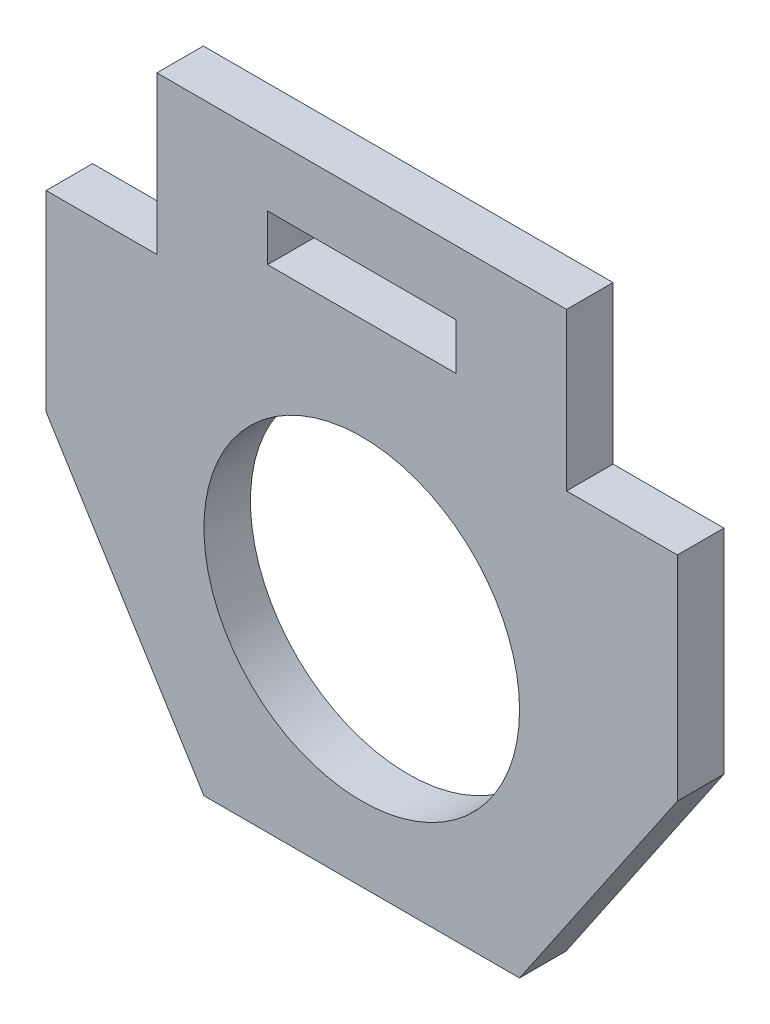
ISO-10303-21;
HEADER;
FILE_DESCRIPTION(('STEP AP214'),'2;1');
FILE_NAME('part.step','',(''),(''),'','','');
FILE_SCHEMA(('AUTOMOTIVE_DESIGN { 1 0 10303 214 1 1 1 1 }'));
ENDSEC;
DATA;
#1=APPLICATION_CONTEXT('core data for automotive mechanical design processes');
#2=APPLICATION_PROTOCOL_DEFINITION('international standard','automotive_design',2000,#1);
#3=PRODUCT_CONTEXT('',#1,'mechanical');
#4=PRODUCT('Part','Part','',(#3));
#5=PRODUCT_RELATED_PRODUCT_CATEGORY('part','',(#4));
#6=PRODUCT_DEFINITION_FORMATION('','',#4);
#7=PRODUCT_DEFINITION_CONTEXT('part definition',#1,'design');
#8=PRODUCT_DEFINITION('design','',#6,#7);
#9=PRODUCT_DEFINITION_SHAPE('','',#8);
#10=(LENGTH_UNIT() NAMED_UNIT(*) SI_UNIT(.MILLI.,.METRE.));
#11=(NAMED_UNIT(*) PLANE_ANGLE_UNIT() SI_UNIT($,.RADIAN.));
#12=(NAMED_UNIT(*) SI_UNIT($,.STERADIAN.) SOLID_ANGLE_UNIT());
#13=UNCERTAINTY_MEASURE_WITH_UNIT(LENGTH_MEASURE(1.E-05),#10,'distance_accuracy_value','');
#14=(GEOMETRIC_REPRESENTATION_CONTEXT(3) GLOBAL_UNCERTAINTY_ASSIGNED_CONTEXT((#13)) GLOBAL_UNIT_ASSIGNED_CONTEXT((#10,
#11,#12)) REPRESENTATION_CONTEXT('',''));
#15=CARTESIAN_POINT('',(0.,0.,0.));
#16=DIRECTION('',(0.,0.,1.));
#17=DIRECTION('',(1.,0.,0.));
#18=AXIS2_PLACEMENT_3D('',#15,#16,#17);
#19=CARTESIAN_POINT('',(0.,0.,5.334));
#20=DIRECTION('',(0.,0.,1.));
#21=DIRECTION('',(1.,0.,0.));
#22=AXIS2_PLACEMENT_3D('',#19,#20,#21);
#23=PLANE('',#22);
#24=CARTESIAN_POINT('',(0.,0.,5.334));
#25=DIRECTION('',(0.,0.,1.));
#26=DIRECTION('',(1.,0.,0.));
#27=AXIS2_PLACEMENT_3D('',#24,#25,#26);
#28=CIRCLE('',#27,18.1);
#29=CARTESIAN_POINT('',(18.1,0.,5.334));
#30=VERTEX_POINT('',#29);
#31=EDGE_CURVE('E436',#30,#30,#28,.T.);
#32=ORIENTED_EDGE('',*,*,#31,.F.);
#33=EDGE_LOOP('',(#32));
#34=FACE_BOUND('',#33,.T.);
#35=DIRECTION('',(0.,-1.,0.));
#36=VECTOR('',#35,1.);
#37=CARTESIAN_POINT('',(-36.2,24.4499922231078,5.334));
#38=LINE('',#37,#36);
#39=CARTESIAN_POINT('',(-36.2,24.4499922231078,5.334));
#40=VERTEX_POINT('',#39);
#41=CARTESIAN_POINT('',(-36.2,2.46257104852757,5.334));
#42=VERTEX_POINT('',#41);
#43=EDGE_CURVE('E174',#40,#42,#38,.T.);
#44=ORIENTED_EDGE('',*,*,#43,.T.);
#45=DIRECTION('',(0.528402190306776,-0.848994184478905,0.));
#46=VECTOR('',#45,1.);
#47=CARTESIAN_POINT('',(-36.2,2.46257104852757,5.334));
#48=LINE('',#47,#46);
#49=CARTESIAN_POINT('',(-18.1,-26.6190546921732,5.334));
#50=VERTEX_POINT('',#49);
#51=EDGE_CURVE('E177',#42,#50,#48,.T.);
#52=ORIENTED_EDGE('',*,*,#51,.T.);
#53=DIRECTION('',(1.,0.,0.));
#54=VECTOR('',#53,1.);
#55=CARTESIAN_POINT('',(-18.1,-26.6190546921732,5.334));
#56=LINE('',#55,#54);
#57=CARTESIAN_POINT('',(18.1,-26.6190546921731,5.334));
#58=VERTEX_POINT('',#57);
#59=EDGE_CURVE('E180',#50,#58,#56,.T.);
#60=ORIENTED_EDGE('',*,*,#59,.T.);
#61=DIRECTION('',(0.562289799995144,0.826940252268216,0.));
#62=VECTOR('',#61,1.);
#63=CARTESIAN_POINT('',(18.1,-26.6190546921731,5.334));
#64=LINE('',#63,#62);
#65=CARTESIAN_POINT('',(36.2,-7.77689220660127E-06,5.334));
#66=VERTEX_POINT('',#65);
#67=EDGE_CURVE('E182',#58,#66,#64,.T.);
#68=ORIENTED_EDGE('',*,*,#67,.T.);
#69=DIRECTION('',(0.,1.,0.));
#70=VECTOR('',#69,1.);
#71=CARTESIAN_POINT('',(36.2,24.4499922231078,5.334));
#72=LINE('',#71,#70);
#73=CARTESIAN_POINT('',(36.2,24.4499922231078,5.334));
#74=VERTEX_POINT('',#73);
#75=EDGE_CURVE('E184',#66,#74,#72,.T.);
#76=ORIENTED_EDGE('',*,*,#75,.T.);
#77=DIRECTION('',(-1.,0.,0.));
#78=VECTOR('',#77,1.);
#79=CARTESIAN_POINT('',(23.49,24.4499922231078,5.334));
#80=LINE('',#79,#78);
#81=CARTESIAN_POINT('',(23.49,24.4499922231078,5.334));
#82=VERTEX_POINT('',#81);
#83=EDGE_CURVE('E186',#74,#82,#80,.T.);
#84=ORIENTED_EDGE('',*,*,#83,.T.);
#85=DIRECTION('',(0.,1.,0.));
#86=VECTOR('',#85,1.);
#87=CARTESIAN_POINT('',(23.49,24.4499922231078,5.334));
#88=LINE('',#87,#86);
#89=CARTESIAN_POINT('',(23.49,42.4839922231078,5.334));
#90=VERTEX_POINT('',#89);
#91=EDGE_CURVE('E188',#82,#90,#88,.T.);
#92=ORIENTED_EDGE('',*,*,#91,.T.);
#93=DIRECTION('',(-1.,0.,0.));
#94=VECTOR('',#93,1.);
#95=CARTESIAN_POINT('',(-23.5,42.4839922231078,5.334));
#96=LINE('',#95,#94);
#97=CARTESIAN_POINT('',(-23.5,42.4839922231078,5.334));
#98=VERTEX_POINT('',#97);
#99=EDGE_CURVE('E190',#90,#98,#96,.T.);
#100=ORIENTED_EDGE('',*,*,#99,.T.);
#101=DIRECTION('',(0.,-1.,0.));
#102=VECTOR('',#101,1.);
#103=CARTESIAN_POINT('',(-23.5,24.4499922231078,5.334));
#104=LINE('',#103,#102);
#105=CARTESIAN_POINT('',(-23.5,24.4499922231078,5.334));
#106=VERTEX_POINT('',#105);
#107=EDGE_CURVE('E192',#98,#106,#104,.T.);
#108=ORIENTED_EDGE('',*,*,#107,.T.);
#109=DIRECTION('',(-1.,0.,0.));
#110=VECTOR('',#109,1.);
#111=CARTESIAN_POINT('',(-36.2,24.4499922231078,5.334));
#112=LINE('',#111,#110);
#113=EDGE_CURVE('E194',#106,#40,#112,.T.);
#114=ORIENTED_EDGE('',*,*,#113,.T.);
#115=EDGE_LOOP('',(#44,#52,#60,#68,#76,#84,#92,#100,#108,#114));
#116=FACE_BOUND('',#115,.T.);
#117=DIRECTION('',(-1.,0.,0.));
#118=VECTOR('',#117,1.);
#119=CARTESIAN_POINT('',(10.79,35.118,5.334));
#120=LINE('',#119,#118);
#121=CARTESIAN_POINT('',(10.79,35.118,5.334));
#122=VERTEX_POINT('',#121);
#123=CARTESIAN_POINT('',(-10.8,35.118,5.334));
#124=VERTEX_POINT('',#123);
#125=EDGE_CURVE('E144',#122,#124,#120,.T.);
#126=ORIENTED_EDGE('',*,*,#125,.F.);
#127=DIRECTION('',(0.,1.,0.));
#128=VECTOR('',#127,1.);
#129=CARTESIAN_POINT('',(10.79,29.784,5.334));
#130=LINE('',#129,#128);
#131=CARTESIAN_POINT('',(10.79,29.784,5.334));
#132=VERTEX_POINT('',#131);
#133=EDGE_CURVE('E136',#132,#122,#130,.T.);
#134=ORIENTED_EDGE('',*,*,#133,.F.);
#135=DIRECTION('',(1.,0.,0.));
#136=VECTOR('',#135,1.);
#137=CARTESIAN_POINT('',(10.79,29.784,5.334));
#138=LINE('',#137,#136);
#139=CARTESIAN_POINT('',(-10.8,29.784,5.334));
#140=VERTEX_POINT('',#139);
#141=EDGE_CURVE('E158',#140,#132,#138,.T.);
#142=ORIENTED_EDGE('',*,*,#141,.F.);
#143=DIRECTION('',(0.,-1.,0.));
#144=VECTOR('',#143,1.);
#145=CARTESIAN_POINT('',(-10.8,29.784,5.334));
#146=LINE('',#145,#144);
#147=EDGE_CURVE('E156',#124,#140,#146,.T.);
#148=ORIENTED_EDGE('',*,*,#147,.F.);
#149=EDGE_LOOP('',(#126,#134,#142,#148));
#150=FACE_BOUND('',#149,.T.);
#151=ADVANCED_FACE('F35',(#34,#116,#150),#23,.T.);
#152=CARTESIAN_POINT('',(0.,0.,0.));
#153=DIRECTION('',(0.,0.,1.));
#154=DIRECTION('',(1.,0.,0.));
#155=AXIS2_PLACEMENT_3D('',#152,#153,#154);
#156=PLANE('',#155);
#157=CARTESIAN_POINT('',(0.,0.,0.));
#158=DIRECTION('',(0.,0.,1.));
#159=DIRECTION('',(1.,0.,0.));
#160=AXIS2_PLACEMENT_3D('',#157,#158,#159);
#161=CIRCLE('',#160,18.1);
#162=CARTESIAN_POINT('',(18.1,0.,0.));
#163=VERTEX_POINT('',#162);
#164=EDGE_CURVE('E164',#163,#163,#161,.T.);
#165=ORIENTED_EDGE('',*,*,#164,.T.);
#166=EDGE_LOOP('',(#165));
#167=FACE_BOUND('',#166,.T.);
#168=DIRECTION('',(0.,-1.,0.));
#169=VECTOR('',#168,1.);
#170=CARTESIAN_POINT('',(-36.2,24.4499922231078,0.));
#171=LINE('',#170,#169);
#172=CARTESIAN_POINT('',(-36.2,24.4499922231078,0.));
#173=VERTEX_POINT('',#172);
#174=CARTESIAN_POINT('',(-36.2,2.46257104852757,0.));
#175=VERTEX_POINT('',#174);
#176=EDGE_CURVE('E152',#173,#175,#171,.T.);
#177=ORIENTED_EDGE('',*,*,#176,.F.);
#178=DIRECTION('',(-1.,0.,0.));
#179=VECTOR('',#178,1.);
#180=CARTESIAN_POINT('',(-36.2,24.4499922231078,0.));
#181=LINE('',#180,#179);
#182=CARTESIAN_POINT('',(-23.5,24.4499922231078,0.));
#183=VERTEX_POINT('',#182);
#184=EDGE_CURVE('E178',#183,#173,#181,.T.);
#185=ORIENTED_EDGE('',*,*,#184,.F.);
#186=DIRECTION('',(0.,-1.,0.));
#187=VECTOR('',#186,1.);
#188=CARTESIAN_POINT('',(-23.5,24.4499922231078,0.));
#189=LINE('',#188,#187);
#190=CARTESIAN_POINT('',(-23.5,42.4839922231078,0.));
#191=VERTEX_POINT('',#190);
#192=EDGE_CURVE('E213',#191,#183,#189,.T.);
#193=ORIENTED_EDGE('',*,*,#192,.F.);
#194=DIRECTION('',(-1.,0.,0.));
#195=VECTOR('',#194,1.);
#196=CARTESIAN_POINT('',(-23.5,42.4839922231078,0.));
#197=LINE('',#196,#195);
#198=CARTESIAN_POINT('',(23.49,42.4839922231078,0.));
#199=VERTEX_POINT('',#198);
#200=EDGE_CURVE('E211',#199,#191,#197,.T.);
#201=ORIENTED_EDGE('',*,*,#200,.F.);
#202=DIRECTION('',(0.,1.,0.));
#203=VECTOR('',#202,1.);
#204=CARTESIAN_POINT('',(23.49,24.4499922231078,0.));
#205=LINE('',#204,#203);
#206=CARTESIAN_POINT('',(23.49,24.4499922231078,0.));
#207=VERTEX_POINT('',#206);
#208=EDGE_CURVE('E209',#207,#199,#205,.T.);
#209=ORIENTED_EDGE('',*,*,#208,.F.);
#210=DIRECTION('',(-1.,0.,0.));
#211=VECTOR('',#210,1.);
#212=CARTESIAN_POINT('',(23.49,24.4499922231078,0.));
#213=LINE('',#212,#211);
#214=CARTESIAN_POINT('',(36.2,24.4499922231078,0.));
#215=VERTEX_POINT('',#214);
#216=EDGE_CURVE('E207',#215,#207,#213,.T.);
#217=ORIENTED_EDGE('',*,*,#216,.F.);
#218=DIRECTION('',(0.,1.,0.));
#219=VECTOR('',#218,1.);
#220=CARTESIAN_POINT('',(36.2,24.4499922231078,0.));
#221=LINE('',#220,#219);
#222=CARTESIAN_POINT('',(36.2,-7.77689220660127E-06,0.));
#223=VERTEX_POINT('',#222);
#224=EDGE_CURVE('E205',#223,#215,#221,.T.);
#225=ORIENTED_EDGE('',*,*,#224,.F.);
#226=DIRECTION('',(0.562289799995144,0.826940252268216,0.));
#227=VECTOR('',#226,1.);
#228=CARTESIAN_POINT('',(18.1,-26.6190546921731,0.));
#229=LINE('',#228,#227);
#230=CARTESIAN_POINT('',(18.1,-26.6190546921731,0.));
#231=VERTEX_POINT('',#230);
#232=EDGE_CURVE('E203',#231,#223,#229,.T.);
#233=ORIENTED_EDGE('',*,*,#232,.F.);
#234=DIRECTION('',(1.,0.,0.));
#235=VECTOR('',#234,1.);
#236=CARTESIAN_POINT('',(-18.1,-26.6190546921732,0.));
#237=LINE('',#236,#235);
#238=CARTESIAN_POINT('',(-18.1,-26.6190546921732,0.));
#239=VERTEX_POINT('',#238);
#240=EDGE_CURVE('E201',#239,#231,#237,.T.);
#241=ORIENTED_EDGE('',*,*,#240,.F.);
#242=DIRECTION('',(0.528402190306776,-0.848994184478905,0.));
#243=VECTOR('',#242,1.);
#244=CARTESIAN_POINT('',(-36.2,2.46257104852757,0.));
#245=LINE('',#244,#243);
#246=EDGE_CURVE('E199',#175,#239,#245,.T.);
#247=ORIENTED_EDGE('',*,*,#246,.F.);
#248=EDGE_LOOP('',(#177,#185,#193,#201,#209,#217,#225,#233,#241,#247));
#249=FACE_BOUND('',#248,.T.);
#250=DIRECTION('',(0.,1.,0.));
#251=VECTOR('',#250,1.);
#252=CARTESIAN_POINT('',(10.79,29.784,0.));
#253=LINE('',#252,#251);
#254=CARTESIAN_POINT('',(10.79,29.784,0.));
#255=VERTEX_POINT('',#254);
#256=CARTESIAN_POINT('',(10.79,35.118,0.));
#257=VERTEX_POINT('',#256);
#258=EDGE_CURVE('E58',#255,#257,#253,.T.);
#259=ORIENTED_EDGE('',*,*,#258,.T.);
#260=DIRECTION('',(-1.,0.,0.));
#261=VECTOR('',#260,1.);
#262=CARTESIAN_POINT('',(10.79,35.118,0.));
#263=LINE('',#262,#261);
#264=CARTESIAN_POINT('',(-10.8,35.118,0.));
#265=VERTEX_POINT('',#264);
#266=EDGE_CURVE('E151',#257,#265,#263,.T.);
#267=ORIENTED_EDGE('',*,*,#266,.T.);
#268=DIRECTION('',(0.,-1.,0.));
#269=VECTOR('',#268,1.);
#270=CARTESIAN_POINT('',(-10.8,29.784,0.));
#271=LINE('',#270,#269);
#272=CARTESIAN_POINT('',(-10.8,29.784,0.));
#273=VERTEX_POINT('',#272);
#274=EDGE_CURVE('E166',#265,#273,#271,.T.);
#275=ORIENTED_EDGE('',*,*,#274,.T.);
#276=DIRECTION('',(1.,0.,0.));
#277=VECTOR('',#276,1.);
#278=CARTESIAN_POINT('',(10.79,29.784,0.));
#279=LINE('',#278,#277);
#280=EDGE_CURVE('E145',#273,#255,#279,.T.);
#281=ORIENTED_EDGE('',*,*,#280,.T.);
#282=EDGE_LOOP('',(#259,#267,#275,#281));
#283=FACE_BOUND('',#282,.T.);
#284=ADVANCED_FACE('F249',(#167,#249,#283),#156,.F.);
#285=CARTESIAN_POINT('',(-36.2,24.4499922231078,5.334));
#286=DIRECTION('',(1.,0.,0.));
#287=DIRECTION('',(0.,0.,-1.));
#288=AXIS2_PLACEMENT_3D('',#285,#286,#287);
#289=PLANE('',#288);
#290=ORIENTED_EDGE('',*,*,#176,.T.);
#291=DIRECTION('',(0.,0.,-1.));
#292=VECTOR('',#291,1.);
#293=CARTESIAN_POINT('',(-36.2,2.46257104852757,5.334));
#294=LINE('',#293,#292);
#295=EDGE_CURVE('E11',#42,#175,#294,.T.);
#296=ORIENTED_EDGE('',*,*,#295,.F.);
#297=ORIENTED_EDGE('',*,*,#43,.F.);
#298=DIRECTION('',(0.,0.,-1.));
#299=VECTOR('',#298,1.);
#300=CARTESIAN_POINT('',(-36.2,24.4499922231078,5.334));
#301=LINE('',#300,#299);
#302=EDGE_CURVE('E196',#40,#173,#301,.T.);
#303=ORIENTED_EDGE('',*,*,#302,.T.);
#304=EDGE_LOOP('',(#290,#296,#297,#303));
#305=FACE_BOUND('',#304,.T.);
#306=ADVANCED_FACE('F37',(#305),#289,.F.);
#307=CARTESIAN_POINT('',(-36.2,2.46257104852757,5.334));
#308=DIRECTION('',(0.848994184478905,0.528402190306776,0.));
#309=DIRECTION('',(-0.528402190306776,0.848994184478905,0.));
#310=AXIS2_PLACEMENT_3D('',#307,#308,#309);
#311=PLANE('',#310);
#312=ORIENTED_EDGE('',*,*,#246,.T.);
#313=DIRECTION('',(0.,0.,-1.));
#314=VECTOR('',#313,1.);
#315=CARTESIAN_POINT('',(-18.1,-26.6190546921732,5.334));
#316=LINE('',#315,#314);
#317=EDGE_CURVE('E43',#50,#239,#316,.T.);
#318=ORIENTED_EDGE('',*,*,#317,.F.);
#319=ORIENTED_EDGE('',*,*,#51,.F.);
#320=ORIENTED_EDGE('',*,*,#295,.T.);
#321=EDGE_LOOP('',(#312,#318,#319,#320));
#322=FACE_BOUND('',#321,.T.);
#323=ADVANCED_FACE('F266',(#322),#311,.F.);
#324=CARTESIAN_POINT('',(-18.1,-26.6190546921732,5.334));
#325=DIRECTION('',(0.,1.,0.));
#326=DIRECTION('',(-1.,0.,0.));
#327=AXIS2_PLACEMENT_3D('',#324,#325,#326);
#328=PLANE('',#327);
#329=ORIENTED_EDGE('',*,*,#240,.T.);
#330=DIRECTION('',(0.,0.,-1.));
#331=VECTOR('',#330,1.);
#332=CARTESIAN_POINT('',(18.1,-26.6190546921731,5.334));
#333=LINE('',#332,#331);
#334=EDGE_CURVE('E236',#58,#231,#333,.T.);
#335=ORIENTED_EDGE('',*,*,#334,.F.);
#336=ORIENTED_EDGE('',*,*,#59,.F.);
#337=ORIENTED_EDGE('',*,*,#317,.T.);
#338=EDGE_LOOP('',(#329,#335,#336,#337));
#339=FACE_BOUND('',#338,.T.);
#340=ADVANCED_FACE('F243',(#339),#328,.F.);
#341=CARTESIAN_POINT('',(18.1,-26.6190546921731,5.334));
#342=DIRECTION('',(-0.826940252268216,0.562289799995144,0.));
#343=DIRECTION('',(-0.562289799995144,-0.826940252268216,0.));
#344=AXIS2_PLACEMENT_3D('',#341,#342,#343);
#345=PLANE('',#344);
#346=ORIENTED_EDGE('',*,*,#232,.T.);
#347=DIRECTION('',(0.,0.,-1.));
#348=VECTOR('',#347,1.);
#349=CARTESIAN_POINT('',(36.2,-7.77689220660127E-06,5.334));
#350=LINE('',#349,#348);
#351=EDGE_CURVE('E233',#66,#223,#350,.T.);
#352=ORIENTED_EDGE('',*,*,#351,.F.);
#353=ORIENTED_EDGE('',*,*,#67,.F.);
#354=ORIENTED_EDGE('',*,*,#334,.T.);
#355=EDGE_LOOP('',(#346,#352,#353,#354));
#356=FACE_BOUND('',#355,.T.);
#357=ADVANCED_FACE('F255',(#356),#345,.F.);
#358=CARTESIAN_POINT('',(36.2,24.4499922231078,5.334));
#359=DIRECTION('',(-1.,0.,0.));
#360=DIRECTION('',(0.,0.,1.));
#361=AXIS2_PLACEMENT_3D('',#358,#359,#360);
#362=PLANE('',#361);
#363=ORIENTED_EDGE('',*,*,#224,.T.);
#364=DIRECTION('',(0.,0.,-1.));
#365=VECTOR('',#364,1.);
#366=CARTESIAN_POINT('',(36.2,24.4499922231078,5.334));
#367=LINE('',#366,#365);
#368=EDGE_CURVE('E230',#74,#215,#367,.T.);
#369=ORIENTED_EDGE('',*,*,#368,.F.);
#370=ORIENTED_EDGE('',*,*,#75,.F.);
#371=ORIENTED_EDGE('',*,*,#351,.T.);
#372=EDGE_LOOP('',(#363,#369,#370,#371));
#373=FACE_BOUND('',#372,.T.);
#374=ADVANCED_FACE('F259',(#373),#362,.F.);
#375=CARTESIAN_POINT('',(23.49,24.4499922231078,5.334));
#376=DIRECTION('',(0.,-1.,0.));
#377=DIRECTION('',(0.,0.,-1.));
#378=AXIS2_PLACEMENT_3D('',#375,#376,#377);
#379=PLANE('',#378);
#380=ORIENTED_EDGE('',*,*,#216,.T.);
#381=DIRECTION('',(0.,0.,-1.));
#382=VECTOR('',#381,1.);
#383=CARTESIAN_POINT('',(23.49,24.4499922231078,5.334));
#384=LINE('',#383,#382);
#385=EDGE_CURVE('E227',#82,#207,#384,.T.);
#386=ORIENTED_EDGE('',*,*,#385,.F.);
#387=ORIENTED_EDGE('',*,*,#83,.F.);
#388=ORIENTED_EDGE('',*,*,#368,.T.);
#389=EDGE_LOOP('',(#380,#386,#387,#388));
#390=FACE_BOUND('',#389,.T.);
#391=ADVANCED_FACE('F289',(#390),#379,.F.);
#392=CARTESIAN_POINT('',(23.49,24.4499922231078,5.334));
#393=DIRECTION('',(-1.,0.,0.));
#394=DIRECTION('',(0.,0.,1.));
#395=AXIS2_PLACEMENT_3D('',#392,#393,#394);
#396=PLANE('',#395);
#397=ORIENTED_EDGE('',*,*,#208,.T.);
#398=DIRECTION('',(0.,0.,-1.));
#399=VECTOR('',#398,1.);
#400=CARTESIAN_POINT('',(23.49,42.4839922231078,5.334));
#401=LINE('',#400,#399);
#402=EDGE_CURVE('E224',#90,#199,#401,.T.);
#403=ORIENTED_EDGE('',*,*,#402,.F.);
#404=ORIENTED_EDGE('',*,*,#91,.F.);
#405=ORIENTED_EDGE('',*,*,#385,.T.);
#406=EDGE_LOOP('',(#397,#403,#404,#405));
#407=FACE_BOUND('',#406,.T.);
#408=ADVANCED_FACE('F286',(#407),#396,.F.);
#409=CARTESIAN_POINT('',(-23.5,42.4839922231078,5.334));
#410=DIRECTION('',(0.,-1.,0.));
#411=DIRECTION('',(0.,0.,-1.));
#412=AXIS2_PLACEMENT_3D('',#409,#410,#411);
#413=PLANE('',#412);
#414=ORIENTED_EDGE('',*,*,#200,.T.);
#415=DIRECTION('',(0.,0.,-1.));
#416=VECTOR('',#415,1.);
#417=CARTESIAN_POINT('',(-23.5,42.4839922231078,5.334));
#418=LINE('',#417,#416);
#419=EDGE_CURVE('E221',#98,#191,#418,.T.);
#420=ORIENTED_EDGE('',*,*,#419,.F.);
#421=ORIENTED_EDGE('',*,*,#99,.F.);
#422=ORIENTED_EDGE('',*,*,#402,.T.);
#423=EDGE_LOOP('',(#414,#420,#421,#422));
#424=FACE_BOUND('',#423,.T.);
#425=ADVANCED_FACE('F282',(#424),#413,.F.);
#426=CARTESIAN_POINT('',(-23.5,24.4499922231078,5.334));
#427=DIRECTION('',(1.,0.,0.));
#428=DIRECTION('',(0.,0.,-1.));
#429=AXIS2_PLACEMENT_3D('',#426,#427,#428);
#430=PLANE('',#429);
#431=ORIENTED_EDGE('',*,*,#192,.T.);
#432=DIRECTION('',(0.,0.,-1.));
#433=VECTOR('',#432,1.);
#434=CARTESIAN_POINT('',(-23.5,24.4499922231078,5.334));
#435=LINE('',#434,#433);
#436=EDGE_CURVE('E218',#106,#183,#435,.T.);
#437=ORIENTED_EDGE('',*,*,#436,.F.);
#438=ORIENTED_EDGE('',*,*,#107,.F.);
#439=ORIENTED_EDGE('',*,*,#419,.T.);
#440=EDGE_LOOP('',(#431,#437,#438,#439));
#441=FACE_BOUND('',#440,.T.);
#442=ADVANCED_FACE('F278',(#441),#430,.F.);
#443=CARTESIAN_POINT('',(-36.2,24.4499922231078,5.334));
#444=DIRECTION('',(0.,-1.,0.));
#445=DIRECTION('',(0.,0.,-1.));
#446=AXIS2_PLACEMENT_3D('',#443,#444,#445);
#447=PLANE('',#446);
#448=ORIENTED_EDGE('',*,*,#184,.T.);
#449=ORIENTED_EDGE('',*,*,#302,.F.);
#450=ORIENTED_EDGE('',*,*,#113,.F.);
#451=ORIENTED_EDGE('',*,*,#436,.T.);
#452=EDGE_LOOP('',(#448,#449,#450,#451));
#453=FACE_BOUND('',#452,.T.);
#454=ADVANCED_FACE('F273',(#453),#447,.F.);
#455=CARTESIAN_POINT('',(10.79,29.784,5.334));
#456=DIRECTION('',(-1.,0.,0.));
#457=DIRECTION('',(0.,0.,1.));
#458=AXIS2_PLACEMENT_3D('',#455,#456,#457);
#459=PLANE('',#458);
#460=ORIENTED_EDGE('',*,*,#258,.F.);
#461=DIRECTION('',(0.,0.,-1.));
#462=VECTOR('',#461,1.);
#463=CARTESIAN_POINT('',(10.79,29.784,5.334));
#464=LINE('',#463,#462);
#465=EDGE_CURVE('E140',#132,#255,#464,.T.);
#466=ORIENTED_EDGE('',*,*,#465,.F.);
#467=ORIENTED_EDGE('',*,*,#133,.T.);
#468=DIRECTION('',(0.,0.,-1.));
#469=VECTOR('',#468,1.);
#470=CARTESIAN_POINT('',(10.79,35.118,5.334));
#471=LINE('',#470,#469);
#472=EDGE_CURVE('E139',#122,#257,#471,.T.);
#473=ORIENTED_EDGE('',*,*,#472,.T.);
#474=EDGE_LOOP('',(#460,#466,#467,#473));
#475=FACE_BOUND('',#474,.T.);
#476=ADVANCED_FACE('F138',(#475),#459,.T.);
#477=CARTESIAN_POINT('',(10.79,35.118,5.334));
#478=DIRECTION('',(0.,-1.,0.));
#479=DIRECTION('',(0.,0.,-1.));
#480=AXIS2_PLACEMENT_3D('',#477,#478,#479);
#481=PLANE('',#480);
#482=ORIENTED_EDGE('',*,*,#266,.F.);
#483=ORIENTED_EDGE('',*,*,#472,.F.);
#484=ORIENTED_EDGE('',*,*,#125,.T.);
#485=DIRECTION('',(0.,0.,-1.));
#486=VECTOR('',#485,1.);
#487=CARTESIAN_POINT('',(-10.8,35.118,5.334));
#488=LINE('',#487,#486);
#489=EDGE_CURVE('E153',#124,#265,#488,.T.);
#490=ORIENTED_EDGE('',*,*,#489,.T.);
#491=EDGE_LOOP('',(#482,#483,#484,#490));
#492=FACE_BOUND('',#491,.T.);
#493=ADVANCED_FACE('F148',(#492),#481,.T.);
#494=CARTESIAN_POINT('',(-10.8,29.784,5.334));
#495=DIRECTION('',(1.,0.,0.));
#496=DIRECTION('',(0.,0.,-1.));
#497=AXIS2_PLACEMENT_3D('',#494,#495,#496);
#498=PLANE('',#497);
#499=ORIENTED_EDGE('',*,*,#274,.F.);
#500=ORIENTED_EDGE('',*,*,#489,.F.);
#501=ORIENTED_EDGE('',*,*,#147,.T.);
#502=DIRECTION('',(0.,0.,-1.));
#503=VECTOR('',#502,1.);
#504=CARTESIAN_POINT('',(-10.8,29.784,5.334));
#505=LINE('',#504,#503);
#506=EDGE_CURVE('E50',#140,#273,#505,.T.);
#507=ORIENTED_EDGE('',*,*,#506,.T.);
#508=EDGE_LOOP('',(#499,#500,#501,#507));
#509=FACE_BOUND('',#508,.T.);
#510=ADVANCED_FACE('F338',(#509),#498,.T.);
#511=CARTESIAN_POINT('',(10.79,29.784,5.334));
#512=DIRECTION('',(0.,1.,0.));
#513=DIRECTION('',(0.,0.,1.));
#514=AXIS2_PLACEMENT_3D('',#511,#512,#513);
#515=PLANE('',#514);
#516=ORIENTED_EDGE('',*,*,#280,.F.);
#517=ORIENTED_EDGE('',*,*,#506,.F.);
#518=ORIENTED_EDGE('',*,*,#141,.T.);
#519=ORIENTED_EDGE('',*,*,#465,.T.);
#520=EDGE_LOOP('',(#516,#517,#518,#519));
#521=FACE_BOUND('',#520,.T.);
#522=ADVANCED_FACE('F344',(#521),#515,.T.);
#523=CARTESIAN_POINT('',(0.,0.,0.));
#524=DIRECTION('',(0.,0.,1.));
#525=DIRECTION('',(1.,0.,0.));
#526=AXIS2_PLACEMENT_3D('',#523,#524,#525);
#527=CYLINDRICAL_SURFACE('',#526,18.1);
#528=ORIENTED_EDGE('',*,*,#164,.F.);
#529=EDGE_LOOP('',(#528));
#530=FACE_BOUND('',#529,.T.);
#531=ORIENTED_EDGE('',*,*,#31,.T.);
#532=EDGE_LOOP('',(#531));
#533=FACE_BOUND('',#532,.T.);
#534=ADVANCED_FACE('F352',(#530,#533),#527,.F.);
#535=CLOSED_SHELL('',(#151,#284,#306,#323,#340,#357,#374,#391,#408,#425,#442,#454,#476,#493,
#510,#522,#534));
#536=MANIFOLD_SOLID_BREP('B2',#535);
#537=ADVANCED_BREP_SHAPE_REPRESENTATION('',(#18,#536),#14);
#538=SHAPE_DEFINITION_REPRESENTATION(#9,#537);
ENDSEC;
END-ISO-10303-21;
